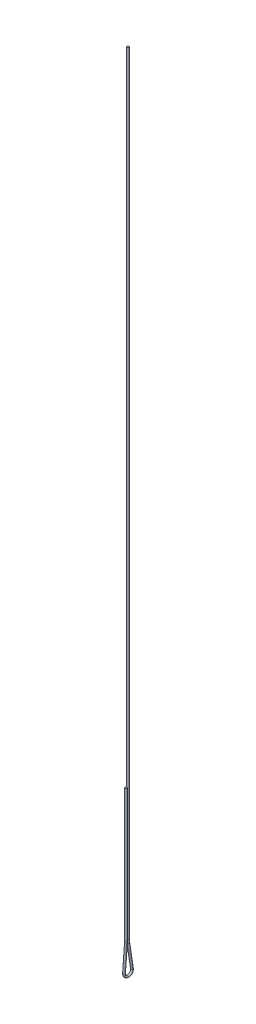
ISO-10303-21;
HEADER;
FILE_DESCRIPTION(('STEP AP214'),'2;1');
FILE_NAME('part.step','',(''),(''),'','','');
FILE_SCHEMA(('AUTOMOTIVE_DESIGN { 1 0 10303 214 1 1 1 1 }'));
ENDSEC;
DATA;
#1=APPLICATION_CONTEXT('core data for automotive mechanical design processes');
#2=APPLICATION_PROTOCOL_DEFINITION('international standard','automotive_design',2000,#1);
#3=PRODUCT_CONTEXT('',#1,'mechanical');
#4=PRODUCT('Part','Part','',(#3));
#5=PRODUCT_RELATED_PRODUCT_CATEGORY('part','',(#4));
#6=PRODUCT_DEFINITION_FORMATION('','',#4);
#7=PRODUCT_DEFINITION_CONTEXT('part definition',#1,'design');
#8=PRODUCT_DEFINITION('design','',#6,#7);
#9=PRODUCT_DEFINITION_SHAPE('','',#8);
#10=(LENGTH_UNIT() NAMED_UNIT(*) SI_UNIT(.MILLI.,.METRE.));
#11=(NAMED_UNIT(*) PLANE_ANGLE_UNIT() SI_UNIT($,.RADIAN.));
#12=(NAMED_UNIT(*) SI_UNIT($,.STERADIAN.) SOLID_ANGLE_UNIT());
#13=UNCERTAINTY_MEASURE_WITH_UNIT(LENGTH_MEASURE(1.E-05),#10,'distance_accuracy_value','');
#14=(GEOMETRIC_REPRESENTATION_CONTEXT(3) GLOBAL_UNCERTAINTY_ASSIGNED_CONTEXT((#13)) GLOBAL_UNIT_ASSIGNED_CONTEXT((#10,
#11,#12)) REPRESENTATION_CONTEXT('',''));
#15=CARTESIAN_POINT('',(0.,0.,0.));
#16=DIRECTION('',(0.,0.,1.));
#17=DIRECTION('',(1.,0.,0.));
#18=AXIS2_PLACEMENT_3D('',#15,#16,#17);
#19=CARTESIAN_POINT('',(0.,21.5085337780988,0.));
#20=DIRECTION('',(0.,1.,0.));
#21=DIRECTION('',(0.,0.,1.));
#22=AXIS2_PLACEMENT_3D('',#19,#20,#21);
#23=CYLINDRICAL_SURFACE('',#22,0.75);
#24=CARTESIAN_POINT('',(0.,21.5085337780988,0.));
#25=DIRECTION('',(0.,-1.,0.));
#26=DIRECTION('',(0.,0.,-1.));
#27=AXIS2_PLACEMENT_3D('',#24,#25,#26);
#28=CIRCLE('',#27,0.75);
#29=CARTESIAN_POINT('',(0.,21.5085337780989,0.749999999999997));
#30=VERTEX_POINT('',#29);
#31=EDGE_CURVE('E37',#30,#30,#28,.T.);
#32=ORIENTED_EDGE('',*,*,#31,.F.);
#33=EDGE_LOOP('',(#32));
#34=FACE_BOUND('',#33,.T.);
#35=CARTESIAN_POINT('',(0.,600.,0.));
#36=DIRECTION('',(0.,-1.,0.));
#37=DIRECTION('',(0.,0.,-1.));
#38=AXIS2_PLACEMENT_3D('',#35,#36,#37);
#39=CIRCLE('',#38,0.75);
#40=CARTESIAN_POINT('',(0.,600.,-0.750000000000002));
#41=VERTEX_POINT('',#40);
#42=EDGE_CURVE('E10',#41,#41,#39,.T.);
#43=ORIENTED_EDGE('',*,*,#42,.T.);
#44=EDGE_LOOP('',(#43));
#45=FACE_BOUND('',#44,.T.);
#46=ADVANCED_FACE('F31',(#34,#45),#23,.T.);
#47=CARTESIAN_POINT('',(0.,21.5085337780987,-20.));
#48=DIRECTION('',(-1.,0.,0.));
#49=DIRECTION('',(0.,0.,1.));
#50=AXIS2_PLACEMENT_3D('',#47,#48,#49);
#51=TOROIDAL_SURFACE('',#50,20.,0.75);
#52=CARTESIAN_POINT('',(0.,18.5085337780987,-0.22628006671482));
#53=DIRECTION('',(0.,-0.988685996664258,-0.150000000000006));
#54=DIRECTION('',(0.,0.150000000000006,-0.988685996664258));
#55=AXIS2_PLACEMENT_3D('',#52,#53,#54);
#56=CIRCLE('',#55,0.75);
#57=CARTESIAN_POINT('',(0.,18.3960337780987,0.515234430783374));
#58=VERTEX_POINT('',#57);
#59=EDGE_CURVE('E41',#58,#58,#56,.T.);
#60=CARTESIAN_POINT('',(0.,21.5085337780987,-20.));
#61=DIRECTION('',(-1.,0.,0.));
#62=DIRECTION('',(0.,0.,1.));
#63=AXIS2_PLACEMENT_3D('',#60,#61,#62);
#64=CIRCLE('',#63,20.75);
#65=EDGE_CURVE('',#58,#30,#64,.T.);
#66=ORIENTED_EDGE('',*,*,#59,.F.);
#67=ORIENTED_EDGE('',*,*,#31,.T.);
#68=ORIENTED_EDGE('',*,*,#65,.T.);
#69=ORIENTED_EDGE('',*,*,#65,.F.);
#70=EDGE_LOOP('',(#66,#68,#67,#69));
#71=FACE_BOUND('',#70,.T.);
#72=ADVANCED_FACE('F87',(#71),#51,.T.);
#73=CARTESIAN_POINT('',(0.,0.450000000000035,-2.96605798999278));
#74=DIRECTION('',(0.,0.988685996664259,0.15));
#75=DIRECTION('',(0.,-0.15,0.98868599666426));
#76=AXIS2_PLACEMENT_3D('',#73,#74,#75);
#77=CYLINDRICAL_SURFACE('',#76,0.75);
#78=CARTESIAN_POINT('',(0.,0.450000000000035,-2.96605798999278));
#79=DIRECTION('',(0.,-0.988685996664258,-0.150000000000006));
#80=DIRECTION('',(0.,0.150000000000006,-0.988685996664258));
#81=AXIS2_PLACEMENT_3D('',#78,#79,#80);
#82=CIRCLE('',#81,0.75);
#83=CARTESIAN_POINT('',(0.,0.562500000000044,-3.70757248749097));
#84=VERTEX_POINT('',#83);
#85=EDGE_CURVE('E45',#84,#84,#82,.T.);
#86=ORIENTED_EDGE('',*,*,#85,.F.);
#87=EDGE_LOOP('',(#86));
#88=FACE_BOUND('',#87,.T.);
#89=ORIENTED_EDGE('',*,*,#59,.T.);
#90=EDGE_LOOP('',(#89));
#91=FACE_BOUND('',#90,.T.);
#92=ADVANCED_FACE('F81',(#88,#91),#77,.T.);
#93=CARTESIAN_POINT('',(0.,0.,0.));
#94=DIRECTION('',(1.,0.,0.));
#95=DIRECTION('',(0.,0.,-1.));
#96=AXIS2_PLACEMENT_3D('',#93,#94,#95);
#97=TOROIDAL_SURFACE('',#96,3.,0.75);
#98=CARTESIAN_POINT('',(0.,0.225637304990103,2.99150260013205));
#99=DIRECTION('',(0.,0.997167533377349,-0.0752124349967062));
#100=DIRECTION('',(0.,0.0752124349967062,0.997167533377349));
#101=AXIS2_PLACEMENT_3D('',#98,#99,#100);
#102=CIRCLE('',#101,0.75);
#103=CARTESIAN_POINT('',(0.,0.282046631237629,3.73937825016506));
#104=VERTEX_POINT('',#103);
#105=EDGE_CURVE('E50',#104,#104,#102,.T.);
#106=CARTESIAN_POINT('',(0.,0.,0.));
#107=DIRECTION('',(1.,0.,0.));
#108=DIRECTION('',(0.,0.,-1.));
#109=AXIS2_PLACEMENT_3D('',#106,#107,#108);
#110=CIRCLE('',#109,3.75);
#111=EDGE_CURVE('',#104,#84,#110,.T.);
#112=ORIENTED_EDGE('',*,*,#105,.F.);
#113=ORIENTED_EDGE('',*,*,#85,.T.);
#114=ORIENTED_EDGE('',*,*,#111,.T.);
#115=ORIENTED_EDGE('',*,*,#111,.F.);
#116=EDGE_LOOP('',(#112,#114,#113,#115));
#117=FACE_BOUND('',#116,.T.);
#118=ADVANCED_FACE('F75',(#117),#97,.T.);
#119=CARTESIAN_POINT('',(0.,19.2489423442796,1.55664933245302));
#120=DIRECTION('',(0.,-0.99716753337735,0.0752124349966987));
#121=DIRECTION('',(0.,-0.0752124349966987,-0.99716753337735));
#122=AXIS2_PLACEMENT_3D('',#119,#120,#121);
#123=CYLINDRICAL_SURFACE('',#122,0.75);
#124=CARTESIAN_POINT('',(0.,19.2489423442796,1.55664933245302));
#125=DIRECTION('',(0.,0.997167533377349,-0.0752124349967062));
#126=DIRECTION('',(0.,0.0752124349967062,0.997167533377349));
#127=AXIS2_PLACEMENT_3D('',#124,#125,#126);
#128=CIRCLE('',#127,0.75);
#129=CARTESIAN_POINT('',(0.,19.192533018032,0.808773682420005));
#130=VERTEX_POINT('',#129);
#131=EDGE_CURVE('E53',#130,#130,#128,.T.);
#132=ORIENTED_EDGE('',*,*,#131,.F.);
#133=EDGE_LOOP('',(#132));
#134=FACE_BOUND('',#133,.T.);
#135=ORIENTED_EDGE('',*,*,#105,.T.);
#136=EDGE_LOOP('',(#135));
#137=FACE_BOUND('',#136,.T.);
#138=ADVANCED_FACE('F69',(#134,#137),#123,.T.);
#139=CARTESIAN_POINT('',(0.,20.7531910442136,21.5));
#140=DIRECTION('',(-1.,0.,0.));
#141=DIRECTION('',(0.,0.,1.));
#142=AXIS2_PLACEMENT_3D('',#139,#140,#141);
#143=TOROIDAL_SURFACE('',#142,20.,0.75);
#144=CARTESIAN_POINT('',(0.,20.7531910442137,1.5));
#145=DIRECTION('',(0.,1.,0.));
#146=DIRECTION('',(0.,0.,1.));
#147=AXIS2_PLACEMENT_3D('',#144,#145,#146);
#148=CIRCLE('',#147,0.75);
#149=CARTESIAN_POINT('',(0.,20.7531910442137,0.750000000000001));
#150=VERTEX_POINT('',#149);
#151=EDGE_CURVE('E56',#150,#150,#148,.T.);
#152=CARTESIAN_POINT('',(0.,20.7531910442136,21.5));
#153=DIRECTION('',(-1.,0.,0.));
#154=DIRECTION('',(0.,0.,1.));
#155=AXIS2_PLACEMENT_3D('',#152,#153,#154);
#156=CIRCLE('',#155,20.75);
#157=EDGE_CURVE('',#150,#130,#156,.T.);
#158=ORIENTED_EDGE('',*,*,#151,.F.);
#159=ORIENTED_EDGE('',*,*,#131,.T.);
#160=ORIENTED_EDGE('',*,*,#157,.T.);
#161=ORIENTED_EDGE('',*,*,#157,.F.);
#162=EDGE_LOOP('',(#158,#160,#159,#161));
#163=FACE_BOUND('',#162,.T.);
#164=ADVANCED_FACE('F66',(#163),#143,.T.);
#165=CARTESIAN_POINT('',(0.,20.7531910442137,1.5));
#166=DIRECTION('',(0.,1.,0.));
#167=DIRECTION('',(0.,0.,1.));
#168=AXIS2_PLACEMENT_3D('',#165,#166,#167);
#169=CYLINDRICAL_SURFACE('',#168,0.75);
#170=ORIENTED_EDGE('',*,*,#151,.T.);
#171=EDGE_LOOP('',(#170));
#172=FACE_BOUND('',#171,.T.);
#173=CARTESIAN_POINT('',(0.,120.,1.5));
#174=DIRECTION('',(0.,1.,0.));
#175=DIRECTION('',(0.,0.,1.));
#176=AXIS2_PLACEMENT_3D('',#173,#174,#175);
#177=CIRCLE('',#176,0.75);
#178=CARTESIAN_POINT('',(0.,120.,2.25));
#179=VERTEX_POINT('',#178);
#180=EDGE_CURVE('E57',#179,#179,#177,.T.);
#181=ORIENTED_EDGE('',*,*,#180,.F.);
#182=EDGE_LOOP('',(#181));
#183=FACE_BOUND('',#182,.T.);
#184=ADVANCED_FACE('F63',(#172,#183),#169,.T.);
#185=CARTESIAN_POINT('',(0.,600.,0.));
#186=DIRECTION('',(0.,-1.,0.));
#187=DIRECTION('',(0.,0.,-1.));
#188=AXIS2_PLACEMENT_3D('',#185,#186,#187);
#189=PLANE('',#188);
#190=ORIENTED_EDGE('',*,*,#42,.F.);
#191=EDGE_LOOP('',(#190));
#192=FACE_BOUND('',#191,.T.);
#193=ADVANCED_FACE('F99',(#192),#189,.F.);
#194=CARTESIAN_POINT('',(0.,120.,1.5));
#195=DIRECTION('',(0.,1.,0.));
#196=DIRECTION('',(0.,0.,1.));
#197=AXIS2_PLACEMENT_3D('',#194,#195,#196);
#198=PLANE('',#197);
#199=ORIENTED_EDGE('',*,*,#180,.T.);
#200=EDGE_LOOP('',(#199));
#201=FACE_BOUND('',#200,.T.);
#202=ADVANCED_FACE('F100',(#201),#198,.T.);
#203=CLOSED_SHELL('',(#46,#72,#92,#118,#138,#164,#184,#193,#202));
#204=MANIFOLD_SOLID_BREP('B2',#203);
#205=ADVANCED_BREP_SHAPE_REPRESENTATION('',(#18,#204),#14);
#206=SHAPE_DEFINITION_REPRESENTATION(#9,#205);
ENDSEC;
END-ISO-10303-21;
